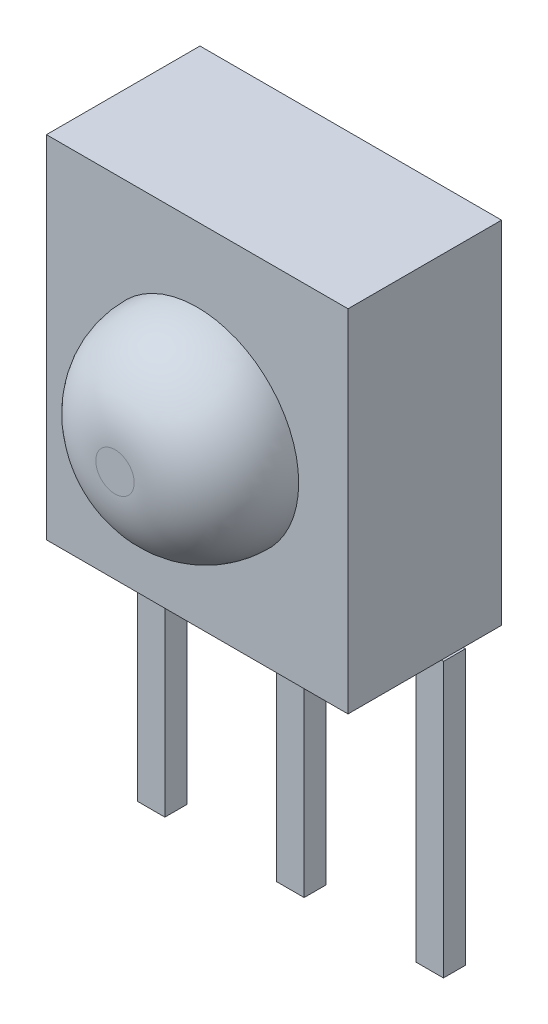
ISO-10303-21;
HEADER;
FILE_DESCRIPTION(('STEP AP214'),'2;1');
FILE_NAME('part.step','',(''),(''),'','','');
FILE_SCHEMA(('AUTOMOTIVE_DESIGN { 1 0 10303 214 1 1 1 1 }'));
ENDSEC;
DATA;
#1=APPLICATION_CONTEXT('core data for automotive mechanical design processes');
#2=APPLICATION_PROTOCOL_DEFINITION('international standard','automotive_design',2000,#1);
#3=PRODUCT_CONTEXT('',#1,'mechanical');
#4=PRODUCT('Part','Part','',(#3));
#5=PRODUCT_RELATED_PRODUCT_CATEGORY('part','',(#4));
#6=PRODUCT_DEFINITION_FORMATION('','',#4);
#7=PRODUCT_DEFINITION_CONTEXT('part definition',#1,'design');
#8=PRODUCT_DEFINITION('design','',#6,#7);
#9=PRODUCT_DEFINITION_SHAPE('','',#8);
#10=(LENGTH_UNIT() NAMED_UNIT(*) SI_UNIT(.MILLI.,.METRE.));
#11=(NAMED_UNIT(*) PLANE_ANGLE_UNIT() SI_UNIT($,.RADIAN.));
#12=(NAMED_UNIT(*) SI_UNIT($,.STERADIAN.) SOLID_ANGLE_UNIT());
#13=UNCERTAINTY_MEASURE_WITH_UNIT(LENGTH_MEASURE(1.E-05),#10,'distance_accuracy_value','');
#14=(GEOMETRIC_REPRESENTATION_CONTEXT(3) GLOBAL_UNCERTAINTY_ASSIGNED_CONTEXT((#13)) GLOBAL_UNIT_ASSIGNED_CONTEXT((#10,
#11,#12)) REPRESENTATION_CONTEXT('',''));
#15=CARTESIAN_POINT('',(0.,0.,0.));
#16=DIRECTION('',(0.,0.,1.));
#17=DIRECTION('',(1.,0.,0.));
#18=AXIS2_PLACEMENT_3D('',#15,#16,#17);
#19=CARTESIAN_POINT('',(2.29,-8.2,1.1));
#20=DIRECTION('',(0.,0.,-1.));
#21=DIRECTION('',(-1.,0.,0.));
#22=AXIS2_PLACEMENT_3D('',#19,#20,#21);
#23=PLANE('',#22);
#24=DIRECTION('',(-1.,0.,0.));
#25=VECTOR('',#24,1.);
#26=CARTESIAN_POINT('',(2.29,-3.2,1.1));
#27=LINE('',#26,#25);
#28=CARTESIAN_POINT('',(2.79,-3.2,1.1));
#29=VERTEX_POINT('',#28);
#30=CARTESIAN_POINT('',(2.29,-3.2,1.1));
#31=VERTEX_POINT('',#30);
#32=EDGE_CURVE('E12',#29,#31,#27,.T.);
#33=ORIENTED_EDGE('',*,*,#32,.T.);
#34=DIRECTION('',(0.,1.,0.));
#35=VECTOR('',#34,1.);
#36=CARTESIAN_POINT('',(2.29,-8.2,1.1));
#37=LINE('',#36,#35);
#38=CARTESIAN_POINT('',(2.29,-8.2,1.1));
#39=VERTEX_POINT('',#38);
#40=EDGE_CURVE('E129',#39,#31,#37,.T.);
#41=ORIENTED_EDGE('',*,*,#40,.F.);
#42=DIRECTION('',(-1.,0.,0.));
#43=VECTOR('',#42,1.);
#44=CARTESIAN_POINT('',(2.29,-8.2,1.1));
#45=LINE('',#44,#43);
#46=CARTESIAN_POINT('',(2.79,-8.2,1.1));
#47=VERTEX_POINT('',#46);
#48=EDGE_CURVE('E62',#47,#39,#45,.T.);
#49=ORIENTED_EDGE('',*,*,#48,.F.);
#50=DIRECTION('',(0.,1.,0.));
#51=VECTOR('',#50,1.);
#52=CARTESIAN_POINT('',(2.79,-8.2,1.1));
#53=LINE('',#52,#51);
#54=EDGE_CURVE('E117',#47,#29,#53,.T.);
#55=ORIENTED_EDGE('',*,*,#54,.T.);
#56=EDGE_LOOP('',(#33,#41,#49,#55));
#57=FACE_BOUND('',#56,.T.);
#58=ADVANCED_FACE('F58',(#57),#23,.F.);
#59=CARTESIAN_POINT('',(2.29,-8.2,0.7));
#60=DIRECTION('',(1.,0.,0.));
#61=DIRECTION('',(0.,0.,-1.));
#62=AXIS2_PLACEMENT_3D('',#59,#60,#61);
#63=PLANE('',#62);
#64=DIRECTION('',(0.,0.,-1.));
#65=VECTOR('',#64,1.);
#66=CARTESIAN_POINT('',(2.29,-3.2,0.7));
#67=LINE('',#66,#65);
#68=CARTESIAN_POINT('',(2.29,-3.2,0.7));
#69=VERTEX_POINT('',#68);
#70=EDGE_CURVE('E68',#31,#69,#67,.T.);
#71=ORIENTED_EDGE('',*,*,#70,.T.);
#72=DIRECTION('',(0.,1.,0.));
#73=VECTOR('',#72,1.);
#74=CARTESIAN_POINT('',(2.29,-8.2,0.7));
#75=LINE('',#74,#73);
#76=CARTESIAN_POINT('',(2.29,-8.2,0.7));
#77=VERTEX_POINT('',#76);
#78=EDGE_CURVE('E113',#77,#69,#75,.T.);
#79=ORIENTED_EDGE('',*,*,#78,.F.);
#80=DIRECTION('',(0.,0.,-1.));
#81=VECTOR('',#80,1.);
#82=CARTESIAN_POINT('',(2.29,-8.2,0.7));
#83=LINE('',#82,#81);
#84=EDGE_CURVE('E92',#39,#77,#83,.T.);
#85=ORIENTED_EDGE('',*,*,#84,.F.);
#86=ORIENTED_EDGE('',*,*,#40,.T.);
#87=EDGE_LOOP('',(#71,#79,#85,#86));
#88=FACE_BOUND('',#87,.T.);
#89=ADVANCED_FACE('F132',(#88),#63,.F.);
#90=CARTESIAN_POINT('',(2.29,-8.2,0.7));
#91=DIRECTION('',(0.,0.,1.));
#92=DIRECTION('',(1.,0.,0.));
#93=AXIS2_PLACEMENT_3D('',#90,#91,#92);
#94=PLANE('',#93);
#95=DIRECTION('',(1.,0.,0.));
#96=VECTOR('',#95,1.);
#97=CARTESIAN_POINT('',(2.29,-3.2,0.7));
#98=LINE('',#97,#96);
#99=CARTESIAN_POINT('',(2.79,-3.2,0.7));
#100=VERTEX_POINT('',#99);
#101=EDGE_CURVE('E108',#69,#100,#98,.T.);
#102=ORIENTED_EDGE('',*,*,#101,.T.);
#103=DIRECTION('',(0.,1.,0.));
#104=VECTOR('',#103,1.);
#105=CARTESIAN_POINT('',(2.79,-8.2,0.7));
#106=LINE('',#105,#104);
#107=CARTESIAN_POINT('',(2.79,-8.2,0.7));
#108=VERTEX_POINT('',#107);
#109=EDGE_CURVE('E111',#108,#100,#106,.T.);
#110=ORIENTED_EDGE('',*,*,#109,.F.);
#111=DIRECTION('',(1.,0.,0.));
#112=VECTOR('',#111,1.);
#113=CARTESIAN_POINT('',(2.29,-8.2,0.7));
#114=LINE('',#113,#112);
#115=EDGE_CURVE('E125',#77,#108,#114,.T.);
#116=ORIENTED_EDGE('',*,*,#115,.F.);
#117=ORIENTED_EDGE('',*,*,#78,.T.);
#118=EDGE_LOOP('',(#102,#110,#116,#117));
#119=FACE_BOUND('',#118,.T.);
#120=ADVANCED_FACE('F109',(#119),#94,.F.);
#121=CARTESIAN_POINT('',(2.79,-8.2,0.7));
#122=DIRECTION('',(-1.,0.,0.));
#123=DIRECTION('',(0.,0.,1.));
#124=AXIS2_PLACEMENT_3D('',#121,#122,#123);
#125=PLANE('',#124);
#126=DIRECTION('',(0.,0.,1.));
#127=VECTOR('',#126,1.);
#128=CARTESIAN_POINT('',(2.79,-3.2,0.7));
#129=LINE('',#128,#127);
#130=EDGE_CURVE('E102',#100,#29,#129,.T.);
#131=ORIENTED_EDGE('',*,*,#130,.T.);
#132=ORIENTED_EDGE('',*,*,#54,.F.);
#133=DIRECTION('',(0.,0.,1.));
#134=VECTOR('',#133,1.);
#135=CARTESIAN_POINT('',(2.79,-8.2,0.7));
#136=LINE('',#135,#134);
#137=EDGE_CURVE('E116',#108,#47,#136,.T.);
#138=ORIENTED_EDGE('',*,*,#137,.F.);
#139=ORIENTED_EDGE('',*,*,#109,.T.);
#140=EDGE_LOOP('',(#131,#132,#138,#139));
#141=FACE_BOUND('',#140,.T.);
#142=ADVANCED_FACE('F115',(#141),#125,.F.);
#143=CARTESIAN_POINT('',(0.,-8.2,0.));
#144=DIRECTION('',(0.,-1.,0.));
#145=DIRECTION('',(0.,0.,-1.));
#146=AXIS2_PLACEMENT_3D('',#143,#144,#145);
#147=PLANE('',#146);
#148=ORIENTED_EDGE('',*,*,#48,.T.);
#149=ORIENTED_EDGE('',*,*,#84,.T.);
#150=ORIENTED_EDGE('',*,*,#115,.T.);
#151=ORIENTED_EDGE('',*,*,#137,.T.);
#152=EDGE_LOOP('',(#148,#149,#150,#151));
#153=FACE_BOUND('',#152,.T.);
#154=ADVANCED_FACE('F60',(#153),#147,.T.);
#155=CARTESIAN_POINT('',(0.,-3.2,0.));
#156=DIRECTION('',(0.,-1.,0.));
#157=DIRECTION('',(0.,0.,-1.));
#158=AXIS2_PLACEMENT_3D('',#155,#156,#157);
#159=PLANE('',#158);
#160=ORIENTED_EDGE('',*,*,#32,.F.);
#161=ORIENTED_EDGE('',*,*,#130,.F.);
#162=ORIENTED_EDGE('',*,*,#101,.F.);
#163=ORIENTED_EDGE('',*,*,#70,.F.);
#164=EDGE_LOOP('',(#160,#161,#162,#163));
#165=FACE_BOUND('',#164,.T.);
#166=ADVANCED_FACE('F119',(#165),#159,.F.);
#167=CLOSED_SHELL('',(#58,#89,#120,#142,#154,#166));
#168=MANIFOLD_SOLID_BREP('B2',#167);
#169=CARTESIAN_POINT('',(-0.25,-8.2,1.1));
#170=DIRECTION('',(0.,0.,-1.));
#171=DIRECTION('',(-1.,0.,0.));
#172=AXIS2_PLACEMENT_3D('',#169,#170,#171);
#173=PLANE('',#172);
#174=DIRECTION('',(-1.,0.,0.));
#175=VECTOR('',#174,1.);
#176=CARTESIAN_POINT('',(-0.25,-3.2,1.1));
#177=LINE('',#176,#175);
#178=CARTESIAN_POINT('',(0.25,-3.2,1.1));
#179=VERTEX_POINT('',#178);
#180=CARTESIAN_POINT('',(-0.25,-3.2,1.1));
#181=VERTEX_POINT('',#180);
#182=EDGE_CURVE('E56',#179,#181,#177,.T.);
#183=ORIENTED_EDGE('',*,*,#182,.T.);
#184=DIRECTION('',(0.,1.,0.));
#185=VECTOR('',#184,1.);
#186=CARTESIAN_POINT('',(-0.25,-8.2,1.1));
#187=LINE('',#186,#185);
#188=CARTESIAN_POINT('',(-0.25,-8.2,1.1));
#189=VERTEX_POINT('',#188);
#190=EDGE_CURVE('E263',#189,#181,#187,.T.);
#191=ORIENTED_EDGE('',*,*,#190,.F.);
#192=DIRECTION('',(-1.,0.,0.));
#193=VECTOR('',#192,1.);
#194=CARTESIAN_POINT('',(-0.25,-8.2,1.1));
#195=LINE('',#194,#193);
#196=CARTESIAN_POINT('',(0.25,-8.2,1.1));
#197=VERTEX_POINT('',#196);
#198=EDGE_CURVE('E196',#197,#189,#195,.T.);
#199=ORIENTED_EDGE('',*,*,#198,.F.);
#200=DIRECTION('',(0.,1.,0.));
#201=VECTOR('',#200,1.);
#202=CARTESIAN_POINT('',(0.25,-8.2,1.1));
#203=LINE('',#202,#201);
#204=EDGE_CURVE('E251',#197,#179,#203,.T.);
#205=ORIENTED_EDGE('',*,*,#204,.T.);
#206=EDGE_LOOP('',(#183,#191,#199,#205));
#207=FACE_BOUND('',#206,.T.);
#208=ADVANCED_FACE('F192',(#207),#173,.F.);
#209=CARTESIAN_POINT('',(-0.25,-8.2,0.7));
#210=DIRECTION('',(1.,0.,0.));
#211=DIRECTION('',(0.,0.,-1.));
#212=AXIS2_PLACEMENT_3D('',#209,#210,#211);
#213=PLANE('',#212);
#214=DIRECTION('',(0.,0.,-1.));
#215=VECTOR('',#214,1.);
#216=CARTESIAN_POINT('',(-0.25,-3.2,0.7));
#217=LINE('',#216,#215);
#218=CARTESIAN_POINT('',(-0.25,-3.2,0.7));
#219=VERTEX_POINT('',#218);
#220=EDGE_CURVE('E202',#181,#219,#217,.T.);
#221=ORIENTED_EDGE('',*,*,#220,.T.);
#222=DIRECTION('',(0.,1.,0.));
#223=VECTOR('',#222,1.);
#224=CARTESIAN_POINT('',(-0.25,-8.2,0.7));
#225=LINE('',#224,#223);
#226=CARTESIAN_POINT('',(-0.25,-8.2,0.7));
#227=VERTEX_POINT('',#226);
#228=EDGE_CURVE('E247',#227,#219,#225,.T.);
#229=ORIENTED_EDGE('',*,*,#228,.F.);
#230=DIRECTION('',(0.,0.,-1.));
#231=VECTOR('',#230,1.);
#232=CARTESIAN_POINT('',(-0.25,-8.2,0.7));
#233=LINE('',#232,#231);
#234=EDGE_CURVE('E226',#189,#227,#233,.T.);
#235=ORIENTED_EDGE('',*,*,#234,.F.);
#236=ORIENTED_EDGE('',*,*,#190,.T.);
#237=EDGE_LOOP('',(#221,#229,#235,#236));
#238=FACE_BOUND('',#237,.T.);
#239=ADVANCED_FACE('F266',(#238),#213,.F.);
#240=CARTESIAN_POINT('',(-0.25,-8.2,0.7));
#241=DIRECTION('',(0.,0.,1.));
#242=DIRECTION('',(1.,0.,0.));
#243=AXIS2_PLACEMENT_3D('',#240,#241,#242);
#244=PLANE('',#243);
#245=DIRECTION('',(1.,0.,0.));
#246=VECTOR('',#245,1.);
#247=CARTESIAN_POINT('',(-0.25,-3.2,0.7));
#248=LINE('',#247,#246);
#249=CARTESIAN_POINT('',(0.25,-3.2,0.7));
#250=VERTEX_POINT('',#249);
#251=EDGE_CURVE('E242',#219,#250,#248,.T.);
#252=ORIENTED_EDGE('',*,*,#251,.T.);
#253=DIRECTION('',(0.,1.,0.));
#254=VECTOR('',#253,1.);
#255=CARTESIAN_POINT('',(0.25,-8.2,0.7));
#256=LINE('',#255,#254);
#257=CARTESIAN_POINT('',(0.25,-8.2,0.7));
#258=VERTEX_POINT('',#257);
#259=EDGE_CURVE('E245',#258,#250,#256,.T.);
#260=ORIENTED_EDGE('',*,*,#259,.F.);
#261=DIRECTION('',(1.,0.,0.));
#262=VECTOR('',#261,1.);
#263=CARTESIAN_POINT('',(-0.25,-8.2,0.7));
#264=LINE('',#263,#262);
#265=EDGE_CURVE('E259',#227,#258,#264,.T.);
#266=ORIENTED_EDGE('',*,*,#265,.F.);
#267=ORIENTED_EDGE('',*,*,#228,.T.);
#268=EDGE_LOOP('',(#252,#260,#266,#267));
#269=FACE_BOUND('',#268,.T.);
#270=ADVANCED_FACE('F243',(#269),#244,.F.);
#271=CARTESIAN_POINT('',(0.25,-8.2,0.7));
#272=DIRECTION('',(-1.,0.,0.));
#273=DIRECTION('',(0.,0.,1.));
#274=AXIS2_PLACEMENT_3D('',#271,#272,#273);
#275=PLANE('',#274);
#276=DIRECTION('',(0.,0.,1.));
#277=VECTOR('',#276,1.);
#278=CARTESIAN_POINT('',(0.25,-3.2,0.7));
#279=LINE('',#278,#277);
#280=EDGE_CURVE('E236',#250,#179,#279,.T.);
#281=ORIENTED_EDGE('',*,*,#280,.T.);
#282=ORIENTED_EDGE('',*,*,#204,.F.);
#283=DIRECTION('',(0.,0.,1.));
#284=VECTOR('',#283,1.);
#285=CARTESIAN_POINT('',(0.25,-8.2,0.7));
#286=LINE('',#285,#284);
#287=EDGE_CURVE('E250',#258,#197,#286,.T.);
#288=ORIENTED_EDGE('',*,*,#287,.F.);
#289=ORIENTED_EDGE('',*,*,#259,.T.);
#290=EDGE_LOOP('',(#281,#282,#288,#289));
#291=FACE_BOUND('',#290,.T.);
#292=ADVANCED_FACE('F249',(#291),#275,.F.);
#293=CARTESIAN_POINT('',(0.,-8.2,0.));
#294=DIRECTION('',(0.,-1.,0.));
#295=DIRECTION('',(0.,0.,-1.));
#296=AXIS2_PLACEMENT_3D('',#293,#294,#295);
#297=PLANE('',#296);
#298=ORIENTED_EDGE('',*,*,#198,.T.);
#299=ORIENTED_EDGE('',*,*,#234,.T.);
#300=ORIENTED_EDGE('',*,*,#265,.T.);
#301=ORIENTED_EDGE('',*,*,#287,.T.);
#302=EDGE_LOOP('',(#298,#299,#300,#301));
#303=FACE_BOUND('',#302,.T.);
#304=ADVANCED_FACE('F194',(#303),#297,.T.);
#305=CARTESIAN_POINT('',(0.,-3.2,0.));
#306=DIRECTION('',(0.,-1.,0.));
#307=DIRECTION('',(0.,0.,-1.));
#308=AXIS2_PLACEMENT_3D('',#305,#306,#307);
#309=PLANE('',#308);
#310=ORIENTED_EDGE('',*,*,#182,.F.);
#311=ORIENTED_EDGE('',*,*,#280,.F.);
#312=ORIENTED_EDGE('',*,*,#251,.F.);
#313=ORIENTED_EDGE('',*,*,#220,.F.);
#314=EDGE_LOOP('',(#310,#311,#312,#313));
#315=FACE_BOUND('',#314,.T.);
#316=ADVANCED_FACE('F253',(#315),#309,.F.);
#317=CLOSED_SHELL('',(#208,#239,#270,#292,#304,#316));
#318=MANIFOLD_SOLID_BREP('B6',#317);
#319=CARTESIAN_POINT('',(-2.29,-8.2,0.7));
#320=DIRECTION('',(-1.,0.,0.));
#321=DIRECTION('',(0.,0.,1.));
#322=AXIS2_PLACEMENT_3D('',#319,#320,#321);
#323=PLANE('',#322);
#324=DIRECTION('',(0.,0.,1.));
#325=VECTOR('',#324,1.);
#326=CARTESIAN_POINT('',(-2.29,-3.2,0.7));
#327=LINE('',#326,#325);
#328=CARTESIAN_POINT('',(-2.29,-3.2,0.7));
#329=VERTEX_POINT('',#328);
#330=CARTESIAN_POINT('',(-2.29,-3.2,1.1));
#331=VERTEX_POINT('',#330);
#332=EDGE_CURVE('E388',#329,#331,#327,.T.);
#333=ORIENTED_EDGE('',*,*,#332,.T.);
#334=DIRECTION('',(0.,1.,0.));
#335=VECTOR('',#334,1.);
#336=CARTESIAN_POINT('',(-2.29,-8.2,1.1));
#337=LINE('',#336,#335);
#338=CARTESIAN_POINT('',(-2.29,-8.2,1.1));
#339=VERTEX_POINT('',#338);
#340=EDGE_CURVE('E190',#339,#331,#337,.T.);
#341=ORIENTED_EDGE('',*,*,#340,.F.);
#342=DIRECTION('',(0.,0.,1.));
#343=VECTOR('',#342,1.);
#344=CARTESIAN_POINT('',(-2.29,-8.2,0.7));
#345=LINE('',#344,#343);
#346=CARTESIAN_POINT('',(-2.29,-8.2,0.7));
#347=VERTEX_POINT('',#346);
#348=EDGE_CURVE('E376',#347,#339,#345,.T.);
#349=ORIENTED_EDGE('',*,*,#348,.F.);
#350=DIRECTION('',(0.,1.,0.));
#351=VECTOR('',#350,1.);
#352=CARTESIAN_POINT('',(-2.29,-8.2,0.7));
#353=LINE('',#352,#351);
#354=EDGE_CURVE('E384',#347,#329,#353,.T.);
#355=ORIENTED_EDGE('',*,*,#354,.T.);
#356=EDGE_LOOP('',(#333,#341,#349,#355));
#357=FACE_BOUND('',#356,.T.);
#358=ADVANCED_FACE('F325',(#357),#323,.F.);
#359=CARTESIAN_POINT('',(-2.79,-8.2,1.1));
#360=DIRECTION('',(0.,0.,-1.));
#361=DIRECTION('',(-1.,0.,0.));
#362=AXIS2_PLACEMENT_3D('',#359,#360,#361);
#363=PLANE('',#362);
#364=DIRECTION('',(-1.,0.,0.));
#365=VECTOR('',#364,1.);
#366=CARTESIAN_POINT('',(-2.79,-3.2,1.1));
#367=LINE('',#366,#365);
#368=CARTESIAN_POINT('',(-2.79,-3.2,1.1));
#369=VERTEX_POINT('',#368);
#370=EDGE_CURVE('E380',#331,#369,#367,.T.);
#371=ORIENTED_EDGE('',*,*,#370,.T.);
#372=DIRECTION('',(0.,1.,0.));
#373=VECTOR('',#372,1.);
#374=CARTESIAN_POINT('',(-2.79,-8.2,1.1));
#375=LINE('',#374,#373);
#376=CARTESIAN_POINT('',(-2.79,-8.2,1.1));
#377=VERTEX_POINT('',#376);
#378=EDGE_CURVE('E333',#377,#369,#375,.T.);
#379=ORIENTED_EDGE('',*,*,#378,.F.);
#380=DIRECTION('',(-1.,0.,0.));
#381=VECTOR('',#380,1.);
#382=CARTESIAN_POINT('',(-2.79,-8.2,1.1));
#383=LINE('',#382,#381);
#384=EDGE_CURVE('E371',#339,#377,#383,.T.);
#385=ORIENTED_EDGE('',*,*,#384,.F.);
#386=ORIENTED_EDGE('',*,*,#340,.T.);
#387=EDGE_LOOP('',(#371,#379,#385,#386));
#388=FACE_BOUND('',#387,.T.);
#389=ADVANCED_FACE('F379',(#388),#363,.F.);
#390=CARTESIAN_POINT('',(-2.79,-8.2,0.7));
#391=DIRECTION('',(1.,0.,0.));
#392=DIRECTION('',(0.,0.,-1.));
#393=AXIS2_PLACEMENT_3D('',#390,#391,#392);
#394=PLANE('',#393);
#395=DIRECTION('',(0.,0.,-1.));
#396=VECTOR('',#395,1.);
#397=CARTESIAN_POINT('',(-2.79,-3.2,0.7));
#398=LINE('',#397,#396);
#399=CARTESIAN_POINT('',(-2.79,-3.2,0.7));
#400=VERTEX_POINT('',#399);
#401=EDGE_CURVE('E358',#369,#400,#398,.T.);
#402=ORIENTED_EDGE('',*,*,#401,.T.);
#403=DIRECTION('',(0.,1.,0.));
#404=VECTOR('',#403,1.);
#405=CARTESIAN_POINT('',(-2.79,-8.2,0.7));
#406=LINE('',#405,#404);
#407=CARTESIAN_POINT('',(-2.79,-8.2,0.7));
#408=VERTEX_POINT('',#407);
#409=EDGE_CURVE('E381',#408,#400,#406,.T.);
#410=ORIENTED_EDGE('',*,*,#409,.F.);
#411=DIRECTION('',(0.,0.,-1.));
#412=VECTOR('',#411,1.);
#413=CARTESIAN_POINT('',(-2.79,-8.2,0.7));
#414=LINE('',#413,#412);
#415=EDGE_CURVE('E374',#377,#408,#414,.T.);
#416=ORIENTED_EDGE('',*,*,#415,.F.);
#417=ORIENTED_EDGE('',*,*,#378,.T.);
#418=EDGE_LOOP('',(#402,#410,#416,#417));
#419=FACE_BOUND('',#418,.T.);
#420=ADVANCED_FACE('F382',(#419),#394,.F.);
#421=CARTESIAN_POINT('',(-2.79,-8.2,0.7));
#422=DIRECTION('',(0.,0.,1.));
#423=DIRECTION('',(1.,0.,0.));
#424=AXIS2_PLACEMENT_3D('',#421,#422,#423);
#425=PLANE('',#424);
#426=DIRECTION('',(1.,0.,0.));
#427=VECTOR('',#426,1.);
#428=CARTESIAN_POINT('',(-2.79,-3.2,0.7));
#429=LINE('',#428,#427);
#430=EDGE_CURVE('E364',#400,#329,#429,.T.);
#431=ORIENTED_EDGE('',*,*,#430,.T.);
#432=ORIENTED_EDGE('',*,*,#354,.F.);
#433=DIRECTION('',(1.,0.,0.));
#434=VECTOR('',#433,1.);
#435=CARTESIAN_POINT('',(-2.79,-8.2,0.7));
#436=LINE('',#435,#434);
#437=EDGE_CURVE('E341',#408,#347,#436,.T.);
#438=ORIENTED_EDGE('',*,*,#437,.F.);
#439=ORIENTED_EDGE('',*,*,#409,.T.);
#440=EDGE_LOOP('',(#431,#432,#438,#439));
#441=FACE_BOUND('',#440,.T.);
#442=ADVANCED_FACE('F395',(#441),#425,.F.);
#443=CARTESIAN_POINT('',(0.,-8.2,0.));
#444=DIRECTION('',(0.,1.,0.));
#445=DIRECTION('',(0.,0.,1.));
#446=AXIS2_PLACEMENT_3D('',#443,#444,#445);
#447=PLANE('',#446);
#448=ORIENTED_EDGE('',*,*,#348,.T.);
#449=ORIENTED_EDGE('',*,*,#384,.T.);
#450=ORIENTED_EDGE('',*,*,#415,.T.);
#451=ORIENTED_EDGE('',*,*,#437,.T.);
#452=EDGE_LOOP('',(#448,#449,#450,#451));
#453=FACE_BOUND('',#452,.T.);
#454=ADVANCED_FACE('F372',(#453),#447,.F.);
#455=CARTESIAN_POINT('',(0.,-3.2,0.));
#456=DIRECTION('',(0.,1.,0.));
#457=DIRECTION('',(0.,0.,1.));
#458=AXIS2_PLACEMENT_3D('',#455,#456,#457);
#459=PLANE('',#458);
#460=ORIENTED_EDGE('',*,*,#332,.F.);
#461=ORIENTED_EDGE('',*,*,#430,.F.);
#462=ORIENTED_EDGE('',*,*,#401,.F.);
#463=ORIENTED_EDGE('',*,*,#370,.F.);
#464=EDGE_LOOP('',(#460,#461,#462,#463));
#465=FACE_BOUND('',#464,.T.);
#466=ADVANCED_FACE('F398',(#465),#459,.T.);
#467=CLOSED_SHELL('',(#358,#389,#420,#442,#454,#466));
#468=MANIFOLD_SOLID_BREP('B50',#467);
#469=CARTESIAN_POINT('',(2.75,-3.2,2.8));
#470=DIRECTION('',(-1.,0.,0.));
#471=DIRECTION('',(0.,0.,1.));
#472=AXIS2_PLACEMENT_3D('',#469,#470,#471);
#473=PLANE('',#472);
#474=DIRECTION('',(0.,1.,0.));
#475=VECTOR('',#474,1.);
#476=CARTESIAN_POINT('',(2.75,-3.2,0.));
#477=LINE('',#476,#475);
#478=CARTESIAN_POINT('',(2.75,-3.2,0.));
#479=VERTEX_POINT('',#478);
#480=CARTESIAN_POINT('',(2.75,3.2,0.));
#481=VERTEX_POINT('',#480);
#482=EDGE_CURVE('E522',#479,#481,#477,.T.);
#483=ORIENTED_EDGE('',*,*,#482,.T.);
#484=DIRECTION('',(0.,0.,-1.));
#485=VECTOR('',#484,1.);
#486=CARTESIAN_POINT('',(2.75,3.2,2.8));
#487=LINE('',#486,#485);
#488=CARTESIAN_POINT('',(2.75,3.2,2.8));
#489=VERTEX_POINT('',#488);
#490=EDGE_CURVE('E511',#489,#481,#487,.T.);
#491=ORIENTED_EDGE('',*,*,#490,.F.);
#492=DIRECTION('',(0.,1.,0.));
#493=VECTOR('',#492,1.);
#494=CARTESIAN_POINT('',(2.75,-3.2,2.8));
#495=LINE('',#494,#493);
#496=CARTESIAN_POINT('',(2.75,-3.2,2.8));
#497=VERTEX_POINT('',#496);
#498=EDGE_CURVE('E503',#497,#489,#495,.T.);
#499=ORIENTED_EDGE('',*,*,#498,.F.);
#500=DIRECTION('',(0.,0.,-1.));
#501=VECTOR('',#500,1.);
#502=CARTESIAN_POINT('',(2.75,-3.2,2.8));
#503=LINE('',#502,#501);
#504=EDGE_CURVE('E518',#497,#479,#503,.T.);
#505=ORIENTED_EDGE('',*,*,#504,.T.);
#506=EDGE_LOOP('',(#483,#491,#499,#505));
#507=FACE_BOUND('',#506,.T.);
#508=ADVANCED_FACE('F449',(#507),#473,.F.);
#509=CARTESIAN_POINT('',(-2.75,3.2,2.8));
#510=DIRECTION('',(0.,-1.,0.));
#511=DIRECTION('',(0.,0.,-1.));
#512=AXIS2_PLACEMENT_3D('',#509,#510,#511);
#513=PLANE('',#512);
#514=DIRECTION('',(-1.,0.,0.));
#515=VECTOR('',#514,1.);
#516=CARTESIAN_POINT('',(-2.75,3.2,0.));
#517=LINE('',#516,#515);
#518=CARTESIAN_POINT('',(-2.75,3.2,0.));
#519=VERTEX_POINT('',#518);
#520=EDGE_CURVE('E509',#481,#519,#517,.T.);
#521=ORIENTED_EDGE('',*,*,#520,.T.);
#522=DIRECTION('',(0.,0.,-1.));
#523=VECTOR('',#522,1.);
#524=CARTESIAN_POINT('',(-2.75,3.2,2.8));
#525=LINE('',#524,#523);
#526=CARTESIAN_POINT('',(-2.75,3.2,2.8));
#527=VERTEX_POINT('',#526);
#528=EDGE_CURVE('E507',#527,#519,#525,.T.);
#529=ORIENTED_EDGE('',*,*,#528,.F.);
#530=DIRECTION('',(-1.,0.,0.));
#531=VECTOR('',#530,1.);
#532=CARTESIAN_POINT('',(-2.75,3.2,2.8));
#533=LINE('',#532,#531);
#534=EDGE_CURVE('E498',#489,#527,#533,.T.);
#535=ORIENTED_EDGE('',*,*,#534,.F.);
#536=ORIENTED_EDGE('',*,*,#490,.T.);
#537=EDGE_LOOP('',(#521,#529,#535,#536));
#538=FACE_BOUND('',#537,.T.);
#539=ADVANCED_FACE('F508',(#538),#513,.F.);
#540=CARTESIAN_POINT('',(-2.75,-3.2,2.8));
#541=DIRECTION('',(1.,0.,0.));
#542=DIRECTION('',(0.,0.,-1.));
#543=AXIS2_PLACEMENT_3D('',#540,#541,#542);
#544=PLANE('',#543);
#545=DIRECTION('',(0.,-1.,0.));
#546=VECTOR('',#545,1.);
#547=CARTESIAN_POINT('',(-2.75,-3.2,0.));
#548=LINE('',#547,#546);
#549=CARTESIAN_POINT('',(-2.75,-3.2,0.));
#550=VERTEX_POINT('',#549);
#551=EDGE_CURVE('E484',#519,#550,#548,.T.);
#552=ORIENTED_EDGE('',*,*,#551,.T.);
#553=DIRECTION('',(0.,0.,-1.));
#554=VECTOR('',#553,1.);
#555=CARTESIAN_POINT('',(-2.75,-3.2,2.8));
#556=LINE('',#555,#554);
#557=CARTESIAN_POINT('',(-2.75,-3.2,2.8));
#558=VERTEX_POINT('',#557);
#559=EDGE_CURVE('E512',#558,#550,#556,.T.);
#560=ORIENTED_EDGE('',*,*,#559,.F.);
#561=DIRECTION('',(0.,-1.,0.));
#562=VECTOR('',#561,1.);
#563=CARTESIAN_POINT('',(-2.75,-3.2,2.8));
#564=LINE('',#563,#562);
#565=EDGE_CURVE('E501',#527,#558,#564,.T.);
#566=ORIENTED_EDGE('',*,*,#565,.F.);
#567=ORIENTED_EDGE('',*,*,#528,.T.);
#568=EDGE_LOOP('',(#552,#560,#566,#567));
#569=FACE_BOUND('',#568,.T.);
#570=ADVANCED_FACE('F514',(#569),#544,.F.);
#571=CARTESIAN_POINT('',(-2.75,-3.2,2.8));
#572=DIRECTION('',(0.,1.,0.));
#573=DIRECTION('',(0.,0.,1.));
#574=AXIS2_PLACEMENT_3D('',#571,#572,#573);
#575=PLANE('',#574);
#576=DIRECTION('',(1.,0.,0.));
#577=VECTOR('',#576,1.);
#578=CARTESIAN_POINT('',(-2.75,-3.2,0.));
#579=LINE('',#578,#577);
#580=EDGE_CURVE('E490',#550,#479,#579,.T.);
#581=ORIENTED_EDGE('',*,*,#580,.T.);
#582=ORIENTED_EDGE('',*,*,#504,.F.);
#583=DIRECTION('',(1.,0.,0.));
#584=VECTOR('',#583,1.);
#585=CARTESIAN_POINT('',(-2.75,-3.2,2.8));
#586=LINE('',#585,#584);
#587=EDGE_CURVE('E467',#558,#497,#586,.T.);
#588=ORIENTED_EDGE('',*,*,#587,.F.);
#589=ORIENTED_EDGE('',*,*,#559,.T.);
#590=EDGE_LOOP('',(#581,#582,#588,#589));
#591=FACE_BOUND('',#590,.T.);
#592=ADVANCED_FACE('F546',(#591),#575,.F.);
#593=CARTESIAN_POINT('',(0.,0.,2.8));
#594=DIRECTION('',(0.,0.,-1.));
#595=DIRECTION('',(-1.,0.,0.));
#596=AXIS2_PLACEMENT_3D('',#593,#594,#595);
#597=PLANE('',#596);
#598=CARTESIAN_POINT('',(0.,0.,2.8));
#599=DIRECTION('',(0.,0.,1.));
#600=DIRECTION('',(1.,0.,0.));
#601=AXIS2_PLACEMENT_3D('',#598,#599,#600);
#602=CIRCLE('',#601,1.85);
#603=CARTESIAN_POINT('',(1.85,0.,2.8));
#604=VERTEX_POINT('',#603);
#605=EDGE_CURVE('E459',#604,#604,#602,.T.);
#606=ORIENTED_EDGE('',*,*,#605,.F.);
#607=EDGE_LOOP('',(#606));
#608=FACE_BOUND('',#607,.T.);
#609=ORIENTED_EDGE('',*,*,#498,.T.);
#610=ORIENTED_EDGE('',*,*,#534,.T.);
#611=ORIENTED_EDGE('',*,*,#565,.T.);
#612=ORIENTED_EDGE('',*,*,#587,.T.);
#613=EDGE_LOOP('',(#609,#610,#611,#612));
#614=FACE_BOUND('',#613,.T.);
#615=ADVANCED_FACE('F499',(#608,#614),#597,.F.);
#616=CARTESIAN_POINT('',(0.,0.,0.));
#617=DIRECTION('',(0.,0.,-1.));
#618=DIRECTION('',(-1.,0.,0.));
#619=AXIS2_PLACEMENT_3D('',#616,#617,#618);
#620=PLANE('',#619);
#621=ORIENTED_EDGE('',*,*,#482,.F.);
#622=ORIENTED_EDGE('',*,*,#580,.F.);
#623=ORIENTED_EDGE('',*,*,#551,.F.);
#624=ORIENTED_EDGE('',*,*,#520,.F.);
#625=EDGE_LOOP('',(#621,#622,#623,#624));
#626=FACE_BOUND('',#625,.T.);
#627=ADVANCED_FACE('F545',(#626),#620,.T.);
#628=CARTESIAN_POINT('',(0.,0.,4.3));
#629=DIRECTION('',(0.,0.,1.));
#630=DIRECTION('',(1.,0.,0.));
#631=AXIS2_PLACEMENT_3D('',#628,#629,#630);
#632=PLANE('',#631);
#633=CARTESIAN_POINT('',(0.,0.,4.3));
#634=DIRECTION('',(0.,0.,1.));
#635=DIRECTION('',(1.,0.,0.));
#636=AXIS2_PLACEMENT_3D('',#633,#634,#635);
#637=CIRCLE('',#636,0.35);
#638=CARTESIAN_POINT('',(0.35,0.,4.3));
#639=VERTEX_POINT('',#638);
#640=EDGE_CURVE('E323',#639,#639,#637,.T.);
#641=ORIENTED_EDGE('',*,*,#640,.T.);
#642=EDGE_LOOP('',(#641));
#643=FACE_BOUND('',#642,.T.);
#644=ADVANCED_FACE('F552',(#643),#632,.T.);
#645=CARTESIAN_POINT('',(0.,0.,2.8));
#646=DIRECTION('',(0.,0.,1.));
#647=DIRECTION('',(1.,0.,0.));
#648=AXIS2_PLACEMENT_3D('',#645,#646,#647);
#649=DEGENERATE_TOROIDAL_SURFACE('',#648,0.35,1.5,.T.);
#650=ORIENTED_EDGE('',*,*,#605,.T.);
#651=EDGE_LOOP('',(#650));
#652=FACE_BOUND('',#651,.T.);
#653=ORIENTED_EDGE('',*,*,#640,.F.);
#654=EDGE_LOOP('',(#653));
#655=FACE_BOUND('',#654,.T.);
#656=ADVANCED_FACE('F451',(#652,#655),#649,.T.);
#657=CLOSED_SHELL('',(#508,#539,#570,#592,#615,#627,#644,#656));
#658=MANIFOLD_SOLID_BREP('B184',#657);
#659=ADVANCED_BREP_SHAPE_REPRESENTATION('',(#18,#168,#318,#468,#658),#14);
#660=SHAPE_DEFINITION_REPRESENTATION(#9,#659);
ENDSEC;
END-ISO-10303-21;
